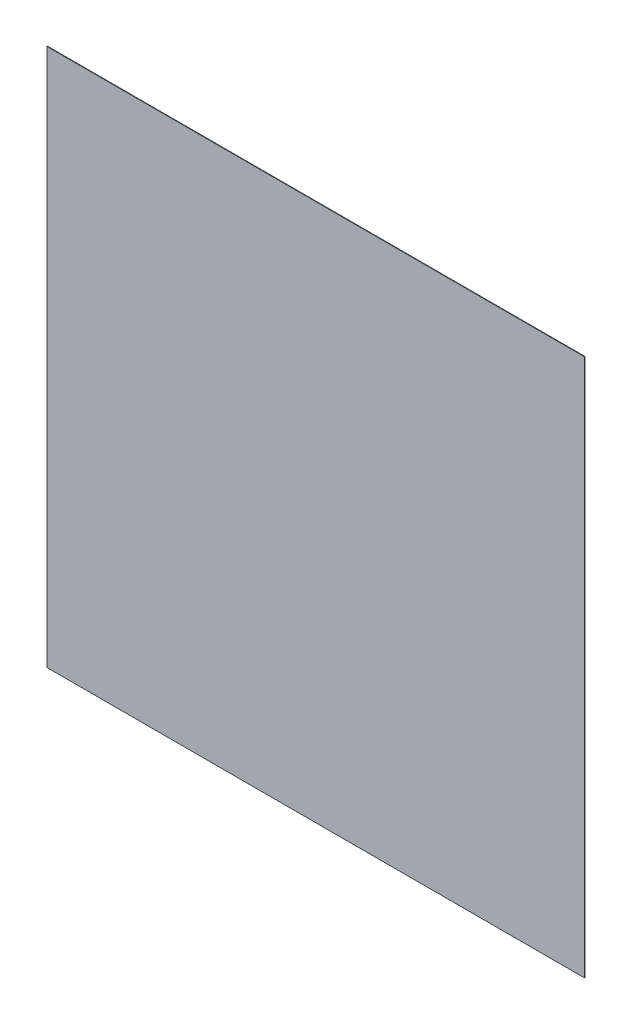
ISO-10303-21;
HEADER;
FILE_DESCRIPTION(('STEP AP214'),'2;1');
FILE_NAME('part.step','',(''),(''),'','','');
FILE_SCHEMA(('AUTOMOTIVE_DESIGN { 1 0 10303 214 1 1 1 1 }'));
ENDSEC;
DATA;
#1=APPLICATION_CONTEXT('core data for automotive mechanical design processes');
#2=APPLICATION_PROTOCOL_DEFINITION('international standard','automotive_design',2000,#1);
#3=PRODUCT_CONTEXT('',#1,'mechanical');
#4=PRODUCT('Part','Part','',(#3));
#5=PRODUCT_RELATED_PRODUCT_CATEGORY('part','',(#4));
#6=PRODUCT_DEFINITION_FORMATION('','',#4);
#7=PRODUCT_DEFINITION_CONTEXT('part definition',#1,'design');
#8=PRODUCT_DEFINITION('design','',#6,#7);
#9=PRODUCT_DEFINITION_SHAPE('','',#8);
#10=(LENGTH_UNIT() NAMED_UNIT(*) SI_UNIT(.MILLI.,.METRE.));
#11=(NAMED_UNIT(*) PLANE_ANGLE_UNIT() SI_UNIT($,.RADIAN.));
#12=(NAMED_UNIT(*) SI_UNIT($,.STERADIAN.) SOLID_ANGLE_UNIT());
#13=UNCERTAINTY_MEASURE_WITH_UNIT(LENGTH_MEASURE(1.E-05),#10,'distance_accuracy_value','');
#14=(GEOMETRIC_REPRESENTATION_CONTEXT(3) GLOBAL_UNCERTAINTY_ASSIGNED_CONTEXT((#13)) GLOBAL_UNIT_ASSIGNED_CONTEXT((#10,
#11,#12)) REPRESENTATION_CONTEXT('',''));
#15=CARTESIAN_POINT('',(0.,0.,0.));
#16=DIRECTION('',(0.,0.,1.));
#17=DIRECTION('',(1.,0.,0.));
#18=AXIS2_PLACEMENT_3D('',#15,#16,#17);
#19=CARTESIAN_POINT('',(0.,0.,1.));
#20=DIRECTION('',(1.,0.,0.));
#21=DIRECTION('',(0.,1.,0.));
#22=AXIS2_PLACEMENT_3D('',#19,#20,#21);
#23=PLANE('',#22);
#24=DIRECTION('',(0.,-1.,0.));
#25=VECTOR('',#24,1.);
#26=CARTESIAN_POINT('',(0.,0.,0.));
#27=LINE('',#26,#25);
#28=CARTESIAN_POINT('',(0.,0.,0.));
#29=VERTEX_POINT('',#28);
#30=CARTESIAN_POINT('',(1.22464679914735E-13,-1000.,0.));
#31=VERTEX_POINT('',#30);
#32=EDGE_CURVE('E111',#29,#31,#27,.T.);
#33=ORIENTED_EDGE('',*,*,#32,.T.);
#34=DIRECTION('',(0.,0.,-1.));
#35=VECTOR('',#34,1.);
#36=CARTESIAN_POINT('',(1.22464679914735E-13,-1000.,1.));
#37=LINE('',#36,#35);
#38=CARTESIAN_POINT('',(1.22464679914735E-13,-1000.,1.));
#39=VERTEX_POINT('',#38);
#40=EDGE_CURVE('E11',#39,#31,#37,.T.);
#41=ORIENTED_EDGE('',*,*,#40,.F.);
#42=DIRECTION('',(0.,-1.,0.));
#43=VECTOR('',#42,1.);
#44=CARTESIAN_POINT('',(0.,0.,1.));
#45=LINE('',#44,#43);
#46=CARTESIAN_POINT('',(0.,0.,1.));
#47=VERTEX_POINT('',#46);
#48=EDGE_CURVE('E100',#47,#39,#45,.T.);
#49=ORIENTED_EDGE('',*,*,#48,.F.);
#50=DIRECTION('',(0.,0.,-1.));
#51=VECTOR('',#50,1.);
#52=CARTESIAN_POINT('',(0.,0.,1.));
#53=LINE('',#52,#51);
#54=EDGE_CURVE('E110',#47,#29,#53,.T.);
#55=ORIENTED_EDGE('',*,*,#54,.T.);
#56=EDGE_LOOP('',(#33,#41,#49,#55));
#57=FACE_BOUND('',#56,.T.);
#58=ADVANCED_FACE('F44',(#57),#23,.F.);
#59=CARTESIAN_POINT('',(1.22464679914735E-13,-1000.,1.));
#60=DIRECTION('',(0.,1.,0.));
#61=DIRECTION('',(0.,0.,1.));
#62=AXIS2_PLACEMENT_3D('',#59,#60,#61);
#63=PLANE('',#62);
#64=DIRECTION('',(1.,0.,0.));
#65=VECTOR('',#64,1.);
#66=CARTESIAN_POINT('',(1.22464679914735E-13,-1000.,0.));
#67=LINE('',#66,#65);
#68=CARTESIAN_POINT('',(1000.,-1000.,0.));
#69=VERTEX_POINT('',#68);
#70=EDGE_CURVE('E105',#31,#69,#67,.T.);
#71=ORIENTED_EDGE('',*,*,#70,.T.);
#72=DIRECTION('',(0.,0.,-1.));
#73=VECTOR('',#72,1.);
#74=CARTESIAN_POINT('',(1000.,-1000.,1.));
#75=LINE('',#74,#73);
#76=CARTESIAN_POINT('',(1000.,-1000.,1.));
#77=VERTEX_POINT('',#76);
#78=EDGE_CURVE('E53',#77,#69,#75,.T.);
#79=ORIENTED_EDGE('',*,*,#78,.F.);
#80=DIRECTION('',(1.,0.,0.));
#81=VECTOR('',#80,1.);
#82=CARTESIAN_POINT('',(1.22464679914735E-13,-1000.,1.));
#83=LINE('',#82,#81);
#84=EDGE_CURVE('E95',#39,#77,#83,.T.);
#85=ORIENTED_EDGE('',*,*,#84,.F.);
#86=ORIENTED_EDGE('',*,*,#40,.T.);
#87=EDGE_LOOP('',(#71,#79,#85,#86));
#88=FACE_BOUND('',#87,.T.);
#89=ADVANCED_FACE('F102',(#88),#63,.F.);
#90=CARTESIAN_POINT('',(1000.,0.,1.));
#91=DIRECTION('',(-1.,0.,0.));
#92=DIRECTION('',(0.,0.,1.));
#93=AXIS2_PLACEMENT_3D('',#90,#91,#92);
#94=PLANE('',#93);
#95=DIRECTION('',(0.,1.,0.));
#96=VECTOR('',#95,1.);
#97=CARTESIAN_POINT('',(1000.,0.,0.));
#98=LINE('',#97,#96);
#99=CARTESIAN_POINT('',(1000.,0.,0.));
#100=VERTEX_POINT('',#99);
#101=EDGE_CURVE('E80',#69,#100,#98,.T.);
#102=ORIENTED_EDGE('',*,*,#101,.T.);
#103=DIRECTION('',(0.,0.,-1.));
#104=VECTOR('',#103,1.);
#105=CARTESIAN_POINT('',(1000.,0.,1.));
#106=LINE('',#105,#104);
#107=CARTESIAN_POINT('',(1000.,0.,1.));
#108=VERTEX_POINT('',#107);
#109=EDGE_CURVE('E101',#108,#100,#106,.T.);
#110=ORIENTED_EDGE('',*,*,#109,.F.);
#111=DIRECTION('',(0.,1.,0.));
#112=VECTOR('',#111,1.);
#113=CARTESIAN_POINT('',(1000.,0.,1.));
#114=LINE('',#113,#112);
#115=EDGE_CURVE('E94',#77,#108,#114,.T.);
#116=ORIENTED_EDGE('',*,*,#115,.F.);
#117=ORIENTED_EDGE('',*,*,#78,.T.);
#118=EDGE_LOOP('',(#102,#110,#116,#117));
#119=FACE_BOUND('',#118,.T.);
#120=ADVANCED_FACE('F103',(#119),#94,.F.);
#121=CARTESIAN_POINT('',(0.,0.,1.));
#122=DIRECTION('',(0.,-1.,0.));
#123=DIRECTION('',(0.,0.,-1.));
#124=AXIS2_PLACEMENT_3D('',#121,#122,#123);
#125=PLANE('',#124);
#126=DIRECTION('',(-1.,0.,0.));
#127=VECTOR('',#126,1.);
#128=CARTESIAN_POINT('',(0.,0.,0.));
#129=LINE('',#128,#127);
#130=EDGE_CURVE('E82',#100,#29,#129,.T.);
#131=ORIENTED_EDGE('',*,*,#130,.T.);
#132=ORIENTED_EDGE('',*,*,#54,.F.);
#133=DIRECTION('',(-1.,0.,0.));
#134=VECTOR('',#133,1.);
#135=CARTESIAN_POINT('',(0.,0.,1.));
#136=LINE('',#135,#134);
#137=EDGE_CURVE('E64',#108,#47,#136,.T.);
#138=ORIENTED_EDGE('',*,*,#137,.F.);
#139=ORIENTED_EDGE('',*,*,#109,.T.);
#140=EDGE_LOOP('',(#131,#132,#138,#139));
#141=FACE_BOUND('',#140,.T.);
#142=ADVANCED_FACE('F128',(#141),#125,.F.);
#143=CARTESIAN_POINT('',(0.,0.,1.));
#144=DIRECTION('',(0.,0.,1.));
#145=DIRECTION('',(1.,0.,0.));
#146=AXIS2_PLACEMENT_3D('',#143,#144,#145);
#147=PLANE('',#146);
#148=ORIENTED_EDGE('',*,*,#48,.T.);
#149=ORIENTED_EDGE('',*,*,#84,.T.);
#150=ORIENTED_EDGE('',*,*,#115,.T.);
#151=ORIENTED_EDGE('',*,*,#137,.T.);
#152=EDGE_LOOP('',(#148,#149,#150,#151));
#153=FACE_BOUND('',#152,.T.);
#154=ADVANCED_FACE('F93',(#153),#147,.T.);
#155=CARTESIAN_POINT('',(0.,0.,0.));
#156=DIRECTION('',(0.,0.,1.));
#157=DIRECTION('',(1.,0.,0.));
#158=AXIS2_PLACEMENT_3D('',#155,#156,#157);
#159=PLANE('',#158);
#160=ORIENTED_EDGE('',*,*,#32,.F.);
#161=ORIENTED_EDGE('',*,*,#130,.F.);
#162=ORIENTED_EDGE('',*,*,#101,.F.);
#163=ORIENTED_EDGE('',*,*,#70,.F.);
#164=EDGE_LOOP('',(#160,#161,#162,#163));
#165=FACE_BOUND('',#164,.T.);
#166=ADVANCED_FACE('F129',(#165),#159,.F.);
#167=CLOSED_SHELL('',(#58,#89,#120,#142,#154,#166));
#168=MANIFOLD_SOLID_BREP('B2',#167);
#169=ADVANCED_BREP_SHAPE_REPRESENTATION('',(#18,#168),#14);
#170=SHAPE_DEFINITION_REPRESENTATION(#9,#169);
ENDSEC;
END-ISO-10303-21;
